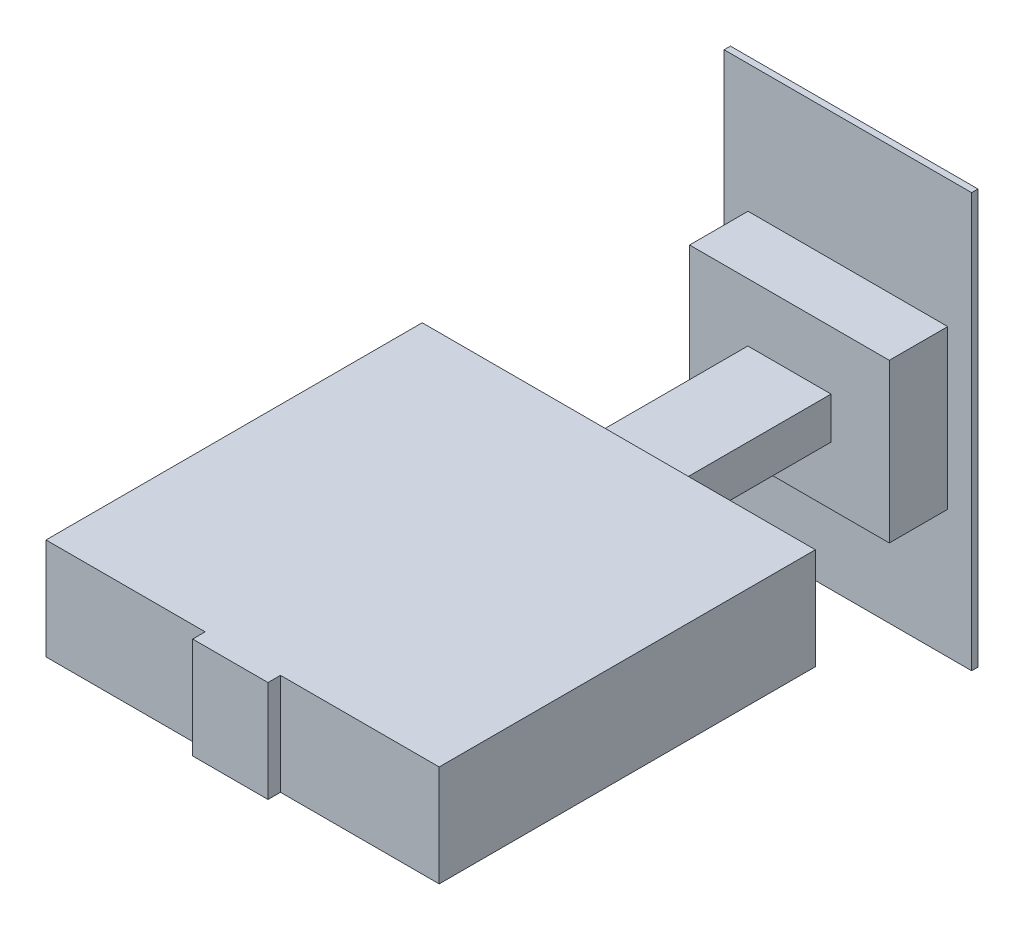
ISO-10303-21;
HEADER;
FILE_DESCRIPTION(('STEP AP214'),'2;1');
FILE_NAME('part.step','',(''),(''),'','','');
FILE_SCHEMA(('AUTOMOTIVE_DESIGN { 1 0 10303 214 1 1 1 1 }'));
ENDSEC;
DATA;
#1=APPLICATION_CONTEXT('core data for automotive mechanical design processes');
#2=APPLICATION_PROTOCOL_DEFINITION('international standard','automotive_design',2000,#1);
#3=PRODUCT_CONTEXT('',#1,'mechanical');
#4=PRODUCT('Part','Part','',(#3));
#5=PRODUCT_RELATED_PRODUCT_CATEGORY('part','',(#4));
#6=PRODUCT_DEFINITION_FORMATION('','',#4);
#7=PRODUCT_DEFINITION_CONTEXT('part definition',#1,'design');
#8=PRODUCT_DEFINITION('design','',#6,#7);
#9=PRODUCT_DEFINITION_SHAPE('','',#8);
#10=(LENGTH_UNIT() NAMED_UNIT(*) SI_UNIT(.MILLI.,.METRE.));
#11=(NAMED_UNIT(*) PLANE_ANGLE_UNIT() SI_UNIT($,.RADIAN.));
#12=(NAMED_UNIT(*) SI_UNIT($,.STERADIAN.) SOLID_ANGLE_UNIT());
#13=UNCERTAINTY_MEASURE_WITH_UNIT(LENGTH_MEASURE(1.E-05),#10,'distance_accuracy_value','');
#14=(GEOMETRIC_REPRESENTATION_CONTEXT(3) GLOBAL_UNCERTAINTY_ASSIGNED_CONTEXT((#13)) GLOBAL_UNIT_ASSIGNED_CONTEXT((#10,
#11,#12)) REPRESENTATION_CONTEXT('',''));
#15=CARTESIAN_POINT('',(0.,0.,0.));
#16=DIRECTION('',(0.,0.,1.));
#17=DIRECTION('',(1.,0.,0.));
#18=AXIS2_PLACEMENT_3D('',#15,#16,#17);
#19=CARTESIAN_POINT('',(-102.10864615755,-258.42777062126,-736.533256852295));
#20=DIRECTION('',(0.,0.,1.));
#21=DIRECTION('',(1.,0.,0.));
#22=AXIS2_PLACEMENT_3D('',#19,#20,#21);
#23=PLANE('',#22);
#24=DIRECTION('',(0.,-1.,0.));
#25=VECTOR('',#24,1.);
#26=CARTESIAN_POINT('',(-161.60864615755,-158.92777062126,-736.533256852295));
#27=LINE('',#26,#25);
#28=CARTESIAN_POINT('',(-161.60864615755,-158.883704983824,-736.533256852295));
#29=VERTEX_POINT('',#28);
#30=CARTESIAN_POINT('',(-161.60864615755,-357.92777062126,-736.533256852295));
#31=VERTEX_POINT('',#30);
#32=EDGE_CURVE('E376',#29,#31,#27,.T.);
#33=ORIENTED_EDGE('',*,*,#32,.F.);
#34=DIRECTION('',(1.,0.,0.));
#35=VECTOR('',#34,1.);
#36=CARTESIAN_POINT('',(-161.60864615755,-158.883704983824,-736.533256852295));
#37=LINE('',#36,#35);
#38=CARTESIAN_POINT('',(-42.60864615755,-158.883704983824,-736.533256852295));
#39=VERTEX_POINT('',#38);
#40=EDGE_CURVE('E187',#29,#39,#37,.T.);
#41=ORIENTED_EDGE('',*,*,#40,.T.);
#42=DIRECTION('',(0.,1.,0.));
#43=VECTOR('',#42,1.);
#44=CARTESIAN_POINT('',(-42.60864615755,-357.92777062126,-736.533256852295));
#45=LINE('',#44,#43);
#46=CARTESIAN_POINT('',(-42.60864615755,-357.92777062126,-736.533256852295));
#47=VERTEX_POINT('',#46);
#48=EDGE_CURVE('E368',#47,#39,#45,.T.);
#49=ORIENTED_EDGE('',*,*,#48,.F.);
#50=DIRECTION('',(1.,0.,0.));
#51=VECTOR('',#50,1.);
#52=CARTESIAN_POINT('',(-161.60864615755,-357.92777062126,-736.533256852295));
#53=LINE('',#52,#51);
#54=EDGE_CURVE('E372',#31,#47,#53,.T.);
#55=ORIENTED_EDGE('',*,*,#54,.F.);
#56=EDGE_LOOP('',(#33,#41,#49,#55));
#57=FACE_BOUND('',#56,.T.);
#58=ADVANCED_FACE('F43',(#57),#23,.F.);
#59=CARTESIAN_POINT('',(-161.60864615755,-158.883704983824,-733.483256852295));
#60=DIRECTION('',(0.,1.,0.));
#61=DIRECTION('',(0.,0.,1.));
#62=AXIS2_PLACEMENT_3D('',#59,#60,#61);
#63=PLANE('',#62);
#64=ORIENTED_EDGE('',*,*,#40,.F.);
#65=DIRECTION('',(0.,0.,-1.));
#66=VECTOR('',#65,1.);
#67=CARTESIAN_POINT('',(-161.60864615755,-158.883704983824,-733.483256852295));
#68=LINE('',#67,#66);
#69=CARTESIAN_POINT('',(-161.60864615755,-158.883704983824,-733.483256852295));
#70=VERTEX_POINT('',#69);
#71=EDGE_CURVE('E181',#70,#29,#68,.T.);
#72=ORIENTED_EDGE('',*,*,#71,.F.);
#73=DIRECTION('',(1.,0.,0.));
#74=VECTOR('',#73,1.);
#75=CARTESIAN_POINT('',(-161.60864615755,-158.883704983824,-733.483256852295));
#76=LINE('',#75,#74);
#77=CARTESIAN_POINT('',(-42.60864615755,-158.883704983824,-733.483256852295));
#78=VERTEX_POINT('',#77);
#79=EDGE_CURVE('E185',#70,#78,#76,.T.);
#80=ORIENTED_EDGE('',*,*,#79,.T.);
#81=DIRECTION('',(0.,0.,-1.));
#82=VECTOR('',#81,1.);
#83=CARTESIAN_POINT('',(-42.60864615755,-158.883704983824,-733.483256852295));
#84=LINE('',#83,#82);
#85=EDGE_CURVE('E192',#78,#39,#84,.T.);
#86=ORIENTED_EDGE('',*,*,#85,.T.);
#87=EDGE_LOOP('',(#64,#72,#80,#86));
#88=FACE_BOUND('',#87,.T.);
#89=ADVANCED_FACE('F183',(#88),#63,.T.);
#90=CARTESIAN_POINT('',(-42.60864615755,-357.92777062126,-736.533256852295));
#91=DIRECTION('',(1.,0.,0.));
#92=DIRECTION('',(0.,1.,0.));
#93=AXIS2_PLACEMENT_3D('',#90,#91,#92);
#94=PLANE('',#93);
#95=ORIENTED_EDGE('',*,*,#48,.T.);
#96=ORIENTED_EDGE('',*,*,#85,.F.);
#97=DIRECTION('',(0.,-1.,0.));
#98=VECTOR('',#97,1.);
#99=CARTESIAN_POINT('',(-42.60864615755,-357.92777062126,-733.483256852295));
#100=LINE('',#99,#98);
#101=CARTESIAN_POINT('',(-42.60864615755,-357.92777062126,-733.483256852295));
#102=VERTEX_POINT('',#101);
#103=EDGE_CURVE('E203',#78,#102,#100,.T.);
#104=ORIENTED_EDGE('',*,*,#103,.T.);
#105=DIRECTION('',(0.,0.,-1.));
#106=VECTOR('',#105,1.);
#107=CARTESIAN_POINT('',(-42.60864615755,-357.92777062126,-733.483256852295));
#108=LINE('',#107,#106);
#109=EDGE_CURVE('E220',#102,#47,#108,.T.);
#110=ORIENTED_EDGE('',*,*,#109,.T.);
#111=EDGE_LOOP('',(#95,#96,#104,#110));
#112=FACE_BOUND('',#111,.T.);
#113=ADVANCED_FACE('F425',(#112),#94,.T.);
#114=CARTESIAN_POINT('',(-161.60864615755,-357.92777062126,-736.533256852295));
#115=DIRECTION('',(0.,-1.,0.));
#116=DIRECTION('',(0.,0.,-1.));
#117=AXIS2_PLACEMENT_3D('',#114,#115,#116);
#118=PLANE('',#117);
#119=ORIENTED_EDGE('',*,*,#54,.T.);
#120=ORIENTED_EDGE('',*,*,#109,.F.);
#121=DIRECTION('',(-1.,0.,0.));
#122=VECTOR('',#121,1.);
#123=CARTESIAN_POINT('',(-161.60864615755,-357.92777062126,-733.483256852295));
#124=LINE('',#123,#122);
#125=CARTESIAN_POINT('',(-161.60864615755,-357.92777062126,-733.483256852295));
#126=VERTEX_POINT('',#125);
#127=EDGE_CURVE('E193',#102,#126,#124,.T.);
#128=ORIENTED_EDGE('',*,*,#127,.T.);
#129=DIRECTION('',(0.,0.,-1.));
#130=VECTOR('',#129,1.);
#131=CARTESIAN_POINT('',(-161.60864615755,-357.92777062126,-733.483256852295));
#132=LINE('',#131,#130);
#133=EDGE_CURVE('E207',#126,#31,#132,.T.);
#134=ORIENTED_EDGE('',*,*,#133,.T.);
#135=EDGE_LOOP('',(#119,#120,#128,#134));
#136=FACE_BOUND('',#135,.T.);
#137=ADVANCED_FACE('F429',(#136),#118,.T.);
#138=CARTESIAN_POINT('',(-161.60864615755,-158.92777062126,-736.533256852295));
#139=DIRECTION('',(-1.,0.,0.));
#140=DIRECTION('',(0.,1.,0.));
#141=AXIS2_PLACEMENT_3D('',#138,#139,#140);
#142=PLANE('',#141);
#143=ORIENTED_EDGE('',*,*,#32,.T.);
#144=ORIENTED_EDGE('',*,*,#133,.F.);
#145=DIRECTION('',(0.,1.,0.));
#146=VECTOR('',#145,1.);
#147=CARTESIAN_POINT('',(-161.60864615755,-357.92777062126,-733.483256852295));
#148=LINE('',#147,#146);
#149=EDGE_CURVE('E200',#126,#70,#148,.T.);
#150=ORIENTED_EDGE('',*,*,#149,.T.);
#151=ORIENTED_EDGE('',*,*,#71,.T.);
#152=EDGE_LOOP('',(#143,#144,#150,#151));
#153=FACE_BOUND('',#152,.T.);
#154=ADVANCED_FACE('F45',(#153),#142,.T.);
#155=CARTESIAN_POINT('',(0.,0.,-733.483256852295));
#156=DIRECTION('',(0.,0.,-1.));
#157=DIRECTION('',(-1.,0.,0.));
#158=AXIS2_PLACEMENT_3D('',#155,#156,#157);
#159=PLANE('',#158);
#160=DIRECTION('',(0.,1.,0.));
#161=VECTOR('',#160,1.);
#162=CARTESIAN_POINT('',(-54.10864615755,-220.37777062126,-733.483256852295));
#163=LINE('',#162,#161);
#164=CARTESIAN_POINT('',(-54.10864615755,-296.42777062126,-733.483256852295));
#165=VERTEX_POINT('',#164);
#166=CARTESIAN_POINT('',(-54.10864615755,-220.37777062126,-733.483256852295));
#167=VERTEX_POINT('',#166);
#168=EDGE_CURVE('E231',#165,#167,#163,.T.);
#169=ORIENTED_EDGE('',*,*,#168,.F.);
#170=DIRECTION('',(-1.,0.,0.));
#171=VECTOR('',#170,1.);
#172=CARTESIAN_POINT('',(0.,-296.42777062126,-733.483256852295));
#173=LINE('',#172,#171);
#174=CARTESIAN_POINT('',(-150.10864615755,-296.42777062126,-733.483256852295));
#175=VERTEX_POINT('',#174);
#176=EDGE_CURVE('E59',#165,#175,#173,.T.);
#177=ORIENTED_EDGE('',*,*,#176,.T.);
#178=DIRECTION('',(0.,-1.,0.));
#179=VECTOR('',#178,1.);
#180=CARTESIAN_POINT('',(-150.10864615755,-220.37777062126,-733.483256852295));
#181=LINE('',#180,#179);
#182=CARTESIAN_POINT('',(-150.10864615755,-220.37777062126,-733.483256852295));
#183=VERTEX_POINT('',#182);
#184=EDGE_CURVE('E11',#183,#175,#181,.T.);
#185=ORIENTED_EDGE('',*,*,#184,.F.);
#186=DIRECTION('',(-1.,0.,0.));
#187=VECTOR('',#186,1.);
#188=CARTESIAN_POINT('',(0.,-220.37777062126,-733.483256852295));
#189=LINE('',#188,#187);
#190=EDGE_CURVE('E219',#167,#183,#189,.T.);
#191=ORIENTED_EDGE('',*,*,#190,.F.);
#192=EDGE_LOOP('',(#169,#177,#185,#191));
#193=FACE_BOUND('',#192,.T.);
#194=ORIENTED_EDGE('',*,*,#149,.F.);
#195=ORIENTED_EDGE('',*,*,#127,.F.);
#196=ORIENTED_EDGE('',*,*,#103,.F.);
#197=ORIENTED_EDGE('',*,*,#79,.F.);
#198=EDGE_LOOP('',(#194,#195,#196,#197));
#199=FACE_BOUND('',#198,.T.);
#200=ADVANCED_FACE('F198',(#193,#199),#159,.F.);
#201=CARTESIAN_POINT('',(-150.10864615755,-220.37777062126,-733.533256852295));
#202=DIRECTION('',(-1.,0.,0.));
#203=DIRECTION('',(0.,0.,1.));
#204=AXIS2_PLACEMENT_3D('',#201,#202,#203);
#205=PLANE('',#204);
#206=DIRECTION('',(0.,0.,-1.));
#207=VECTOR('',#206,1.);
#208=CARTESIAN_POINT('',(-150.10864615755,-220.37777062126,-733.533256852295));
#209=LINE('',#208,#207);
#210=CARTESIAN_POINT('',(-150.10864615755,-220.37777062126,-705.403048294019));
#211=VERTEX_POINT('',#210);
#212=EDGE_CURVE('E343',#211,#183,#209,.T.);
#213=ORIENTED_EDGE('',*,*,#212,.T.);
#214=ORIENTED_EDGE('',*,*,#184,.T.);
#215=DIRECTION('',(0.,0.,-1.));
#216=VECTOR('',#215,1.);
#217=CARTESIAN_POINT('',(-150.10864615755,-296.42777062126,-733.533256852295));
#218=LINE('',#217,#216);
#219=CARTESIAN_POINT('',(-150.10864615755,-296.42777062126,-705.403048294019));
#220=VERTEX_POINT('',#219);
#221=EDGE_CURVE('E339',#220,#175,#218,.T.);
#222=ORIENTED_EDGE('',*,*,#221,.F.);
#223=DIRECTION('',(0.,-1.,0.));
#224=VECTOR('',#223,1.);
#225=CARTESIAN_POINT('',(-150.10864615755,-220.37777062126,-705.403048294019));
#226=LINE('',#225,#224);
#227=EDGE_CURVE('E365',#211,#220,#226,.T.);
#228=ORIENTED_EDGE('',*,*,#227,.F.);
#229=EDGE_LOOP('',(#213,#214,#222,#228));
#230=FACE_BOUND('',#229,.T.);
#231=ADVANCED_FACE('F549',(#230),#205,.T.);
#232=CARTESIAN_POINT('',(0.,-220.37777062126,0.));
#233=DIRECTION('',(0.,1.,0.));
#234=DIRECTION('',(0.,0.,1.));
#235=AXIS2_PLACEMENT_3D('',#232,#233,#234);
#236=PLANE('',#235);
#237=DIRECTION('',(0.,0.,1.));
#238=VECTOR('',#237,1.);
#239=CARTESIAN_POINT('',(-54.10864615755,-220.37777062126,-733.533256852295));
#240=LINE('',#239,#238);
#241=CARTESIAN_POINT('',(-54.10864615755,-220.37777062126,-705.403048294019));
#242=VERTEX_POINT('',#241);
#243=EDGE_CURVE('E347',#167,#242,#240,.T.);
#244=ORIENTED_EDGE('',*,*,#243,.F.);
#245=ORIENTED_EDGE('',*,*,#190,.T.);
#246=ORIENTED_EDGE('',*,*,#212,.F.);
#247=DIRECTION('',(-1.,0.,0.));
#248=VECTOR('',#247,1.);
#249=CARTESIAN_POINT('',(-150.10864615755,-220.37777062126,-705.403048294019));
#250=LINE('',#249,#248);
#251=EDGE_CURVE('E351',#242,#211,#250,.T.);
#252=ORIENTED_EDGE('',*,*,#251,.F.);
#253=EDGE_LOOP('',(#244,#245,#246,#252));
#254=FACE_BOUND('',#253,.T.);
#255=ADVANCED_FACE('F554',(#254),#236,.T.);
#256=CARTESIAN_POINT('',(-54.10864615755,-220.37777062126,-733.533256852295));
#257=DIRECTION('',(1.,0.,0.));
#258=DIRECTION('',(0.,0.,-1.));
#259=AXIS2_PLACEMENT_3D('',#256,#257,#258);
#260=PLANE('',#259);
#261=DIRECTION('',(0.,0.,1.));
#262=VECTOR('',#261,1.);
#263=CARTESIAN_POINT('',(-54.10864615755,-296.42777062126,-733.533256852295));
#264=LINE('',#263,#262);
#265=CARTESIAN_POINT('',(-54.10864615755,-296.42777062126,-705.403048294019));
#266=VERTEX_POINT('',#265);
#267=EDGE_CURVE('E359',#165,#266,#264,.T.);
#268=ORIENTED_EDGE('',*,*,#267,.F.);
#269=ORIENTED_EDGE('',*,*,#168,.T.);
#270=ORIENTED_EDGE('',*,*,#243,.T.);
#271=DIRECTION('',(0.,-1.,0.));
#272=VECTOR('',#271,1.);
#273=CARTESIAN_POINT('',(-54.10864615755,-220.37777062126,-705.403048294019));
#274=LINE('',#273,#272);
#275=EDGE_CURVE('E355',#242,#266,#274,.T.);
#276=ORIENTED_EDGE('',*,*,#275,.T.);
#277=EDGE_LOOP('',(#268,#269,#270,#276));
#278=FACE_BOUND('',#277,.T.);
#279=ADVANCED_FACE('F558',(#278),#260,.T.);
#280=CARTESIAN_POINT('',(0.,-296.42777062126,0.));
#281=DIRECTION('',(0.,1.,0.));
#282=DIRECTION('',(0.,0.,1.));
#283=AXIS2_PLACEMENT_3D('',#280,#281,#282);
#284=PLANE('',#283);
#285=ORIENTED_EDGE('',*,*,#176,.F.);
#286=ORIENTED_EDGE('',*,*,#267,.T.);
#287=DIRECTION('',(-1.,0.,0.));
#288=VECTOR('',#287,1.);
#289=CARTESIAN_POINT('',(-150.10864615755,-296.42777062126,-705.403048294019));
#290=LINE('',#289,#288);
#291=EDGE_CURVE('E348',#266,#220,#290,.T.);
#292=ORIENTED_EDGE('',*,*,#291,.T.);
#293=ORIENTED_EDGE('',*,*,#221,.T.);
#294=EDGE_LOOP('',(#285,#286,#292,#293));
#295=FACE_BOUND('',#294,.T.);
#296=ADVANCED_FACE('F544',(#295),#284,.F.);
#297=CARTESIAN_POINT('',(-150.10864615755,-220.37777062126,-705.403048294019));
#298=DIRECTION('',(0.,0.,1.));
#299=DIRECTION('',(0.,-1.,0.));
#300=AXIS2_PLACEMENT_3D('',#297,#298,#299);
#301=PLANE('',#300);
#302=ORIENTED_EDGE('',*,*,#291,.F.);
#303=ORIENTED_EDGE('',*,*,#275,.F.);
#304=ORIENTED_EDGE('',*,*,#251,.T.);
#305=ORIENTED_EDGE('',*,*,#227,.T.);
#306=EDGE_LOOP('',(#302,#303,#304,#305));
#307=FACE_BOUND('',#306,.T.);
#308=DIRECTION('',(0.,-1.,0.));
#309=VECTOR('',#308,1.);
#310=CARTESIAN_POINT('',(-122.10864615755,-220.37777062126,-705.403048294019));
#311=LINE('',#310,#309);
#312=CARTESIAN_POINT('',(-122.10864615755,-248.427770621259,-705.403048294019));
#313=VERTEX_POINT('',#312);
#314=CARTESIAN_POINT('',(-122.108646157551,-268.42777062126,-705.403048294019));
#315=VERTEX_POINT('',#314);
#316=EDGE_CURVE('E66',#313,#315,#311,.T.);
#317=ORIENTED_EDGE('',*,*,#316,.F.);
#318=DIRECTION('',(1.,0.,0.));
#319=VECTOR('',#318,1.);
#320=CARTESIAN_POINT('',(-150.10864615755,-248.42777062126,-705.403048294019));
#321=LINE('',#320,#319);
#322=CARTESIAN_POINT('',(-82.108646157553,-248.42777062126,-705.403048294019));
#323=VERTEX_POINT('',#322);
#324=EDGE_CURVE('E52',#313,#323,#321,.T.);
#325=ORIENTED_EDGE('',*,*,#324,.T.);
#326=DIRECTION('',(0.,1.,0.));
#327=VECTOR('',#326,1.);
#328=CARTESIAN_POINT('',(-82.108646157553,-220.37777062126,-705.403048294019));
#329=LINE('',#328,#327);
#330=CARTESIAN_POINT('',(-82.108646157553,-268.42777062126,-705.403048294019));
#331=VERTEX_POINT('',#330);
#332=EDGE_CURVE('E384',#331,#323,#329,.T.);
#333=ORIENTED_EDGE('',*,*,#332,.F.);
#334=DIRECTION('',(1.,0.,0.));
#335=VECTOR('',#334,1.);
#336=CARTESIAN_POINT('',(-150.10864615755,-268.42777062126,-705.403048294019));
#337=LINE('',#336,#335);
#338=EDGE_CURVE('E375',#315,#331,#337,.T.);
#339=ORIENTED_EDGE('',*,*,#338,.F.);
#340=EDGE_LOOP('',(#317,#325,#333,#339));
#341=FACE_BOUND('',#340,.T.);
#342=ADVANCED_FACE('F390',(#307,#341),#301,.T.);
#343=CARTESIAN_POINT('',(0.,-248.42777062126,0.));
#344=DIRECTION('',(0.,-1.,0.));
#345=DIRECTION('',(0.,0.,-1.));
#346=AXIS2_PLACEMENT_3D('',#343,#344,#345);
#347=PLANE('',#346);
#348=ORIENTED_EDGE('',*,*,#324,.F.);
#349=DIRECTION('',(0.,0.,-1.));
#350=VECTOR('',#349,1.);
#351=CARTESIAN_POINT('',(-122.108646157551,-248.42777062126,-623.364180108933));
#352=LINE('',#351,#350);
#353=CARTESIAN_POINT('',(-122.108646157551,-248.427770621259,-623.364180108933));
#354=VERTEX_POINT('',#353);
#355=EDGE_CURVE('E315',#354,#313,#352,.T.);
#356=ORIENTED_EDGE('',*,*,#355,.F.);
#357=DIRECTION('',(-1.,0.,0.));
#358=VECTOR('',#357,1.);
#359=CARTESIAN_POINT('',(-122.108646157551,-248.42777062126,-623.364180108933));
#360=LINE('',#359,#358);
#361=CARTESIAN_POINT('',(-82.108646157551,-248.42777062126,-623.364180108933));
#362=VERTEX_POINT('',#361);
#363=EDGE_CURVE('E323',#362,#354,#360,.T.);
#364=ORIENTED_EDGE('',*,*,#363,.F.);
#365=DIRECTION('',(0.,0.,1.));
#366=VECTOR('',#365,1.);
#367=CARTESIAN_POINT('',(-82.108646157553,-248.42777062126,-623.364180108933));
#368=LINE('',#367,#366);
#369=EDGE_CURVE('E319',#323,#362,#368,.T.);
#370=ORIENTED_EDGE('',*,*,#369,.F.);
#371=EDGE_LOOP('',(#348,#356,#364,#370));
#372=FACE_BOUND('',#371,.T.);
#373=ADVANCED_FACE('F399',(#372),#347,.F.);
#374=CARTESIAN_POINT('',(-82.108646157553,-248.42777062126,-623.364180108933));
#375=DIRECTION('',(1.,0.,0.));
#376=DIRECTION('',(0.,0.,-1.));
#377=AXIS2_PLACEMENT_3D('',#374,#375,#376);
#378=PLANE('',#377);
#379=DIRECTION('',(0.,0.,1.));
#380=VECTOR('',#379,1.);
#381=CARTESIAN_POINT('',(-82.108646157553,-268.42777062126,-623.364180108933));
#382=LINE('',#381,#380);
#383=CARTESIAN_POINT('',(-82.108646157553,-268.42777062126,-623.364180108933));
#384=VERTEX_POINT('',#383);
#385=EDGE_CURVE('E330',#331,#384,#382,.T.);
#386=ORIENTED_EDGE('',*,*,#385,.F.);
#387=ORIENTED_EDGE('',*,*,#332,.T.);
#388=ORIENTED_EDGE('',*,*,#369,.T.);
#389=DIRECTION('',(0.,-1.,0.));
#390=VECTOR('',#389,1.);
#391=CARTESIAN_POINT('',(-82.108646157553,-248.42777062126,-623.364180108933));
#392=LINE('',#391,#390);
#393=EDGE_CURVE('E326',#362,#384,#392,.T.);
#394=ORIENTED_EDGE('',*,*,#393,.T.);
#395=EDGE_LOOP('',(#386,#387,#388,#394));
#396=FACE_BOUND('',#395,.T.);
#397=ADVANCED_FACE('F396',(#396),#378,.T.);
#398=CARTESIAN_POINT('',(0.,-268.42777062126,0.));
#399=DIRECTION('',(0.,-1.,0.));
#400=DIRECTION('',(0.,0.,-1.));
#401=AXIS2_PLACEMENT_3D('',#398,#399,#400);
#402=PLANE('',#401);
#403=DIRECTION('',(0.,0.,-1.));
#404=VECTOR('',#403,1.);
#405=CARTESIAN_POINT('',(-122.108646157551,-268.42777062126,-623.364180108933));
#406=LINE('',#405,#404);
#407=CARTESIAN_POINT('',(-122.108646157551,-268.42777062126,-623.364180108933));
#408=VERTEX_POINT('',#407);
#409=EDGE_CURVE('E314',#408,#315,#406,.T.);
#410=ORIENTED_EDGE('',*,*,#409,.T.);
#411=ORIENTED_EDGE('',*,*,#338,.T.);
#412=ORIENTED_EDGE('',*,*,#385,.T.);
#413=DIRECTION('',(-1.,0.,0.));
#414=VECTOR('',#413,1.);
#415=CARTESIAN_POINT('',(-122.108646157551,-268.42777062126,-623.364180108933));
#416=LINE('',#415,#414);
#417=EDGE_CURVE('E320',#384,#408,#416,.T.);
#418=ORIENTED_EDGE('',*,*,#417,.T.);
#419=EDGE_LOOP('',(#410,#411,#412,#418));
#420=FACE_BOUND('',#419,.T.);
#421=ADVANCED_FACE('F409',(#420),#402,.T.);
#422=CARTESIAN_POINT('',(-122.10864615755,-237.553963175573,-722.659449406609));
#423=DIRECTION('',(-1.,0.,0.));
#424=DIRECTION('',(0.,0.,1.));
#425=AXIS2_PLACEMENT_3D('',#422,#423,#424);
#426=PLANE('',#425);
#427=ORIENTED_EDGE('',*,*,#355,.T.);
#428=ORIENTED_EDGE('',*,*,#316,.T.);
#429=ORIENTED_EDGE('',*,*,#409,.F.);
#430=DIRECTION('',(0.,-1.,0.));
#431=VECTOR('',#430,1.);
#432=CARTESIAN_POINT('',(-122.108646157551,-248.42777062126,-623.364180108933));
#433=LINE('',#432,#431);
#434=EDGE_CURVE('E336',#354,#408,#433,.T.);
#435=ORIENTED_EDGE('',*,*,#434,.F.);
#436=EDGE_LOOP('',(#427,#428,#429,#435));
#437=FACE_BOUND('',#436,.T.);
#438=ADVANCED_FACE('F407',(#437),#426,.T.);
#439=CARTESIAN_POINT('',(1.54931554949661E-13,-283.677770621252,-623.364180108933));
#440=DIRECTION('',(0.,0.,1.));
#441=DIRECTION('',(0.,-1.,0.));
#442=AXIS2_PLACEMENT_3D('',#439,#440,#441);
#443=PLANE('',#442);
#444=ORIENTED_EDGE('',*,*,#434,.T.);
#445=ORIENTED_EDGE('',*,*,#417,.F.);
#446=ORIENTED_EDGE('',*,*,#393,.F.);
#447=ORIENTED_EDGE('',*,*,#363,.T.);
#448=EDGE_LOOP('',(#444,#445,#446,#447));
#449=FACE_BOUND('',#448,.T.);
#450=DIRECTION('',(0.,1.,0.));
#451=VECTOR('',#450,1.);
#452=CARTESIAN_POINT('',(-196.608646157568,-283.677770621252,-623.364180108933));
#453=LINE('',#452,#451);
#454=CARTESIAN_POINT('',(-196.608646157568,-283.677770621252,-623.364180108933));
#455=VERTEX_POINT('',#454);
#456=CARTESIAN_POINT('',(-196.608646157568,-234.977770621252,-623.364180108933));
#457=VERTEX_POINT('',#456);
#458=EDGE_CURVE('E310',#455,#457,#453,.T.);
#459=ORIENTED_EDGE('',*,*,#458,.T.);
#460=DIRECTION('',(1.,0.,0.));
#461=VECTOR('',#460,1.);
#462=CARTESIAN_POINT('',(1.22490838170114E-13,-234.977770621252,-623.364180108933));
#463=LINE('',#462,#461);
#464=CARTESIAN_POINT('',(-7.60864615756762,-234.977770621252,-623.364180108933));
#465=VERTEX_POINT('',#464);
#466=EDGE_CURVE('E238',#457,#465,#463,.T.);
#467=ORIENTED_EDGE('',*,*,#466,.T.);
#468=DIRECTION('',(0.,1.,0.));
#469=VECTOR('',#468,1.);
#470=CARTESIAN_POINT('',(-7.60864615756759,-283.677770621252,-623.364180108933));
#471=LINE('',#470,#469);
#472=CARTESIAN_POINT('',(-7.60864615756759,-283.677770621252,-623.364180108933));
#473=VERTEX_POINT('',#472);
#474=EDGE_CURVE('E306',#473,#465,#471,.T.);
#475=ORIENTED_EDGE('',*,*,#474,.F.);
#476=DIRECTION('',(1.,0.,0.));
#477=VECTOR('',#476,1.);
#478=CARTESIAN_POINT('',(1.54931554949661E-13,-283.677770621252,-623.364180108933));
#479=LINE('',#478,#477);
#480=EDGE_CURVE('E265',#455,#473,#479,.T.);
#481=ORIENTED_EDGE('',*,*,#480,.F.);
#482=EDGE_LOOP('',(#459,#467,#475,#481));
#483=FACE_BOUND('',#482,.T.);
#484=ADVANCED_FACE('F402',(#449,#483),#443,.F.);
#485=CARTESIAN_POINT('',(1.54931554949661E-13,-283.677770621252,-442.533256852297));
#486=DIRECTION('',(0.,0.,1.));
#487=DIRECTION('',(0.,-1.,0.));
#488=AXIS2_PLACEMENT_3D('',#485,#486,#487);
#489=PLANE('',#488);
#490=DIRECTION('',(1.,0.,0.));
#491=VECTOR('',#490,1.);
#492=CARTESIAN_POINT('',(1.22490838170114E-13,-234.977770621252,-442.533256852297));
#493=LINE('',#492,#491);
#494=CARTESIAN_POINT('',(-83.8954908769799,-234.977770621252,-442.533256852297));
#495=VERTEX_POINT('',#494);
#496=CARTESIAN_POINT('',(-7.60864615756762,-234.977770621252,-442.533256852297));
#497=VERTEX_POINT('',#496);
#498=EDGE_CURVE('E245',#495,#497,#493,.T.);
#499=ORIENTED_EDGE('',*,*,#498,.F.);
#500=DIRECTION('',(0.,1.,0.));
#501=VECTOR('',#500,1.);
#502=CARTESIAN_POINT('',(-83.8954908769799,-283.677770621252,-442.533256852297));
#503=LINE('',#502,#501);
#504=CARTESIAN_POINT('',(-83.8954908769799,-283.677770621252,-442.533256852297));
#505=VERTEX_POINT('',#504);
#506=EDGE_CURVE('E300',#505,#495,#503,.T.);
#507=ORIENTED_EDGE('',*,*,#506,.F.);
#508=DIRECTION('',(1.,0.,0.));
#509=VECTOR('',#508,1.);
#510=CARTESIAN_POINT('',(1.54931554949661E-13,-283.677770621252,-442.533256852297));
#511=LINE('',#510,#509);
#512=CARTESIAN_POINT('',(-7.60864615756759,-283.677770621252,-442.533256852297));
#513=VERTEX_POINT('',#512);
#514=EDGE_CURVE('E272',#505,#513,#511,.T.);
#515=ORIENTED_EDGE('',*,*,#514,.T.);
#516=DIRECTION('',(0.,1.,0.));
#517=VECTOR('',#516,1.);
#518=CARTESIAN_POINT('',(-7.60864615756759,-283.677770621252,-442.533256852297));
#519=LINE('',#518,#517);
#520=EDGE_CURVE('E303',#513,#497,#519,.T.);
#521=ORIENTED_EDGE('',*,*,#520,.T.);
#522=EDGE_LOOP('',(#499,#507,#515,#521));
#523=FACE_BOUND('',#522,.T.);
#524=ADVANCED_FACE('F591',(#523),#489,.T.);
#525=CARTESIAN_POINT('',(-83.8954908769799,-283.677770621252,0.));
#526=DIRECTION('',(-1.,0.,0.));
#527=DIRECTION('',(0.,-1.,0.));
#528=AXIS2_PLACEMENT_3D('',#525,#526,#527);
#529=PLANE('',#528);
#530=ORIENTED_EDGE('',*,*,#506,.T.);
#531=DIRECTION('',(0.,0.,1.));
#532=VECTOR('',#531,1.);
#533=CARTESIAN_POINT('',(-83.8954908769799,-234.977770621252,0.));
#534=LINE('',#533,#532);
#535=CARTESIAN_POINT('',(-83.8954908769799,-234.977770621252,-436.533256852291));
#536=VERTEX_POINT('',#535);
#537=EDGE_CURVE('E249',#495,#536,#534,.T.);
#538=ORIENTED_EDGE('',*,*,#537,.T.);
#539=DIRECTION('',(0.,1.,0.));
#540=VECTOR('',#539,1.);
#541=CARTESIAN_POINT('',(-83.8954908769799,-283.677770621252,-436.533256852291));
#542=LINE('',#541,#540);
#543=CARTESIAN_POINT('',(-83.8954908769799,-283.677770621252,-436.533256852291));
#544=VERTEX_POINT('',#543);
#545=EDGE_CURVE('E297',#544,#536,#542,.T.);
#546=ORIENTED_EDGE('',*,*,#545,.F.);
#547=DIRECTION('',(0.,0.,1.));
#548=VECTOR('',#547,1.);
#549=CARTESIAN_POINT('',(-83.8954908769799,-283.677770621252,0.));
#550=LINE('',#549,#548);
#551=EDGE_CURVE('E276',#505,#544,#550,.T.);
#552=ORIENTED_EDGE('',*,*,#551,.F.);
#553=EDGE_LOOP('',(#530,#538,#546,#552));
#554=FACE_BOUND('',#553,.T.);
#555=ADVANCED_FACE('F598',(#554),#529,.F.);
#556=CARTESIAN_POINT('',(1.54931554949661E-13,-283.677770621252,-436.533256852291));
#557=DIRECTION('',(0.,0.,1.));
#558=DIRECTION('',(0.,-1.,0.));
#559=AXIS2_PLACEMENT_3D('',#556,#557,#558);
#560=PLANE('',#559);
#561=DIRECTION('',(1.,0.,0.));
#562=VECTOR('',#561,1.);
#563=CARTESIAN_POINT('',(1.22490838170114E-13,-234.977770621252,-436.533256852291));
#564=LINE('',#563,#562);
#565=CARTESIAN_POINT('',(-120.108646157569,-234.977770621252,-436.533256852291));
#566=VERTEX_POINT('',#565);
#567=EDGE_CURVE('E254',#566,#536,#564,.T.);
#568=ORIENTED_EDGE('',*,*,#567,.F.);
#569=DIRECTION('',(0.,1.,0.));
#570=VECTOR('',#569,1.);
#571=CARTESIAN_POINT('',(-120.108646157568,-283.677770621252,-436.533256852291));
#572=LINE('',#571,#570);
#573=CARTESIAN_POINT('',(-120.108646157568,-283.677770621252,-436.533256852291));
#574=VERTEX_POINT('',#573);
#575=EDGE_CURVE('E294',#574,#566,#572,.T.);
#576=ORIENTED_EDGE('',*,*,#575,.F.);
#577=DIRECTION('',(1.,0.,0.));
#578=VECTOR('',#577,1.);
#579=CARTESIAN_POINT('',(1.54931554949661E-13,-283.677770621252,-436.533256852291));
#580=LINE('',#579,#578);
#581=EDGE_CURVE('E280',#574,#544,#580,.T.);
#582=ORIENTED_EDGE('',*,*,#581,.T.);
#583=ORIENTED_EDGE('',*,*,#545,.T.);
#584=EDGE_LOOP('',(#568,#576,#582,#583));
#585=FACE_BOUND('',#584,.T.);
#586=ADVANCED_FACE('F594',(#585),#560,.T.);
#587=CARTESIAN_POINT('',(-120.108646157551,-283.677770621252,4.72271672329327E-12));
#588=DIRECTION('',(-1.,0.,0.));
#589=DIRECTION('',(0.,0.,1.));
#590=AXIS2_PLACEMENT_3D('',#587,#588,#589);
#591=PLANE('',#590);
#592=DIRECTION('',(0.,0.,1.));
#593=VECTOR('',#592,1.);
#594=CARTESIAN_POINT('',(-120.108646157551,-234.977770621252,4.72279322138567E-12));
#595=LINE('',#594,#593);
#596=CARTESIAN_POINT('',(-120.108646157569,-234.977770621252,-442.533256852297));
#597=VERTEX_POINT('',#596);
#598=EDGE_CURVE('E258',#597,#566,#595,.T.);
#599=ORIENTED_EDGE('',*,*,#598,.F.);
#600=DIRECTION('',(0.,1.,0.));
#601=VECTOR('',#600,1.);
#602=CARTESIAN_POINT('',(-120.108646157569,-283.677770621252,-442.533256852297));
#603=LINE('',#602,#601);
#604=CARTESIAN_POINT('',(-120.108646157569,-283.677770621252,-442.533256852297));
#605=VERTEX_POINT('',#604);
#606=EDGE_CURVE('E291',#605,#597,#603,.T.);
#607=ORIENTED_EDGE('',*,*,#606,.F.);
#608=DIRECTION('',(0.,0.,1.));
#609=VECTOR('',#608,1.);
#610=CARTESIAN_POINT('',(-120.108646157551,-283.677770621252,4.72271672329327E-12));
#611=LINE('',#610,#609);
#612=EDGE_CURVE('E284',#605,#574,#611,.T.);
#613=ORIENTED_EDGE('',*,*,#612,.T.);
#614=ORIENTED_EDGE('',*,*,#575,.T.);
#615=EDGE_LOOP('',(#599,#607,#613,#614));
#616=FACE_BOUND('',#615,.T.);
#617=ADVANCED_FACE('F589',(#616),#591,.T.);
#618=ORIENTED_EDGE('',*,*,#606,.T.);
#619=CARTESIAN_POINT('',(-196.608646157568,-234.977770621252,-442.533256852297));
#620=VERTEX_POINT('',#619);
#621=EDGE_CURVE('E250',#620,#597,#493,.T.);
#622=ORIENTED_EDGE('',*,*,#621,.F.);
#623=DIRECTION('',(0.,1.,0.));
#624=VECTOR('',#623,1.);
#625=CARTESIAN_POINT('',(-196.608646157568,-283.677770621252,-442.533256852297));
#626=LINE('',#625,#624);
#627=CARTESIAN_POINT('',(-196.608646157568,-283.677770621252,-442.533256852297));
#628=VERTEX_POINT('',#627);
#629=EDGE_CURVE('E288',#628,#620,#626,.T.);
#630=ORIENTED_EDGE('',*,*,#629,.F.);
#631=EDGE_CURVE('E277',#628,#605,#511,.T.);
#632=ORIENTED_EDGE('',*,*,#631,.T.);
#633=EDGE_LOOP('',(#618,#622,#630,#632));
#634=FACE_BOUND('',#633,.T.);
#635=ADVANCED_FACE('F492',(#634),#489,.T.);
#636=CARTESIAN_POINT('',(-196.608646157568,-283.677770621252,0.));
#637=DIRECTION('',(1.,0.,0.));
#638=DIRECTION('',(0.,1.,0.));
#639=AXIS2_PLACEMENT_3D('',#636,#637,#638);
#640=PLANE('',#639);
#641=DIRECTION('',(0.,0.,-1.));
#642=VECTOR('',#641,1.);
#643=CARTESIAN_POINT('',(-196.608646157568,-234.977770621252,0.));
#644=LINE('',#643,#642);
#645=EDGE_CURVE('E235',#620,#457,#644,.T.);
#646=ORIENTED_EDGE('',*,*,#645,.T.);
#647=ORIENTED_EDGE('',*,*,#458,.F.);
#648=DIRECTION('',(0.,0.,-1.));
#649=VECTOR('',#648,1.);
#650=CARTESIAN_POINT('',(-196.608646157568,-283.677770621252,0.));
#651=LINE('',#650,#649);
#652=EDGE_CURVE('E262',#628,#455,#651,.T.);
#653=ORIENTED_EDGE('',*,*,#652,.F.);
#654=ORIENTED_EDGE('',*,*,#629,.T.);
#655=EDGE_LOOP('',(#646,#647,#653,#654));
#656=FACE_BOUND('',#655,.T.);
#657=ADVANCED_FACE('F485',(#656),#640,.F.);
#658=CARTESIAN_POINT('',(-7.60864615756759,-283.677770621252,0.));
#659=DIRECTION('',(1.,0.,0.));
#660=DIRECTION('',(0.,1.,0.));
#661=AXIS2_PLACEMENT_3D('',#658,#659,#660);
#662=PLANE('',#661);
#663=ORIENTED_EDGE('',*,*,#474,.T.);
#664=DIRECTION('',(0.,0.,-1.));
#665=VECTOR('',#664,1.);
#666=CARTESIAN_POINT('',(-7.60864615756762,-234.977770621252,0.));
#667=LINE('',#666,#665);
#668=EDGE_CURVE('E242',#497,#465,#667,.T.);
#669=ORIENTED_EDGE('',*,*,#668,.F.);
#670=ORIENTED_EDGE('',*,*,#520,.F.);
#671=DIRECTION('',(0.,0.,-1.));
#672=VECTOR('',#671,1.);
#673=CARTESIAN_POINT('',(-7.60864615756759,-283.677770621252,0.));
#674=LINE('',#673,#672);
#675=EDGE_CURVE('E269',#513,#473,#674,.T.);
#676=ORIENTED_EDGE('',*,*,#675,.T.);
#677=EDGE_LOOP('',(#663,#669,#670,#676));
#678=FACE_BOUND('',#677,.T.);
#679=ADVANCED_FACE('F491',(#678),#662,.T.);
#680=CARTESIAN_POINT('',(1.54931554949661E-13,-283.677770621252,0.));
#681=DIRECTION('',(0.,-1.,0.));
#682=DIRECTION('',(1.,0.,0.));
#683=AXIS2_PLACEMENT_3D('',#680,#681,#682);
#684=PLANE('',#683);
#685=ORIENTED_EDGE('',*,*,#652,.T.);
#686=ORIENTED_EDGE('',*,*,#480,.T.);
#687=ORIENTED_EDGE('',*,*,#675,.F.);
#688=ORIENTED_EDGE('',*,*,#514,.F.);
#689=ORIENTED_EDGE('',*,*,#551,.T.);
#690=ORIENTED_EDGE('',*,*,#581,.F.);
#691=ORIENTED_EDGE('',*,*,#612,.F.);
#692=ORIENTED_EDGE('',*,*,#631,.F.);
#693=EDGE_LOOP('',(#685,#686,#687,#688,#689,#690,#691,#692));
#694=FACE_BOUND('',#693,.T.);
#695=ADVANCED_FACE('F504',(#694),#684,.T.);
#696=CARTESIAN_POINT('',(1.22490838170114E-13,-234.977770621252,0.));
#697=DIRECTION('',(0.,-1.,0.));
#698=DIRECTION('',(1.,0.,0.));
#699=AXIS2_PLACEMENT_3D('',#696,#697,#698);
#700=PLANE('',#699);
#701=ORIENTED_EDGE('',*,*,#645,.F.);
#702=ORIENTED_EDGE('',*,*,#621,.T.);
#703=ORIENTED_EDGE('',*,*,#598,.T.);
#704=ORIENTED_EDGE('',*,*,#567,.T.);
#705=ORIENTED_EDGE('',*,*,#537,.F.);
#706=ORIENTED_EDGE('',*,*,#498,.T.);
#707=ORIENTED_EDGE('',*,*,#668,.T.);
#708=ORIENTED_EDGE('',*,*,#466,.F.);
#709=EDGE_LOOP('',(#701,#702,#703,#704,#705,#706,#707,#708));
#710=FACE_BOUND('',#709,.T.);
#711=ADVANCED_FACE('F517',(#710),#700,.F.);
#712=CLOSED_SHELL('',(#58,#89,#113,#137,#154,#200,#231,#255,#279,#296,#342,#373,#397,#421,#438,
#484,#524,#555,#586,#617,#635,#657,#679,#695,#711));
#713=MANIFOLD_SOLID_BREP('B2',#712);
#714=ADVANCED_BREP_SHAPE_REPRESENTATION('',(#18,#713),#14);
#715=SHAPE_DEFINITION_REPRESENTATION(#9,#714);
ENDSEC;
END-ISO-10303-21;
